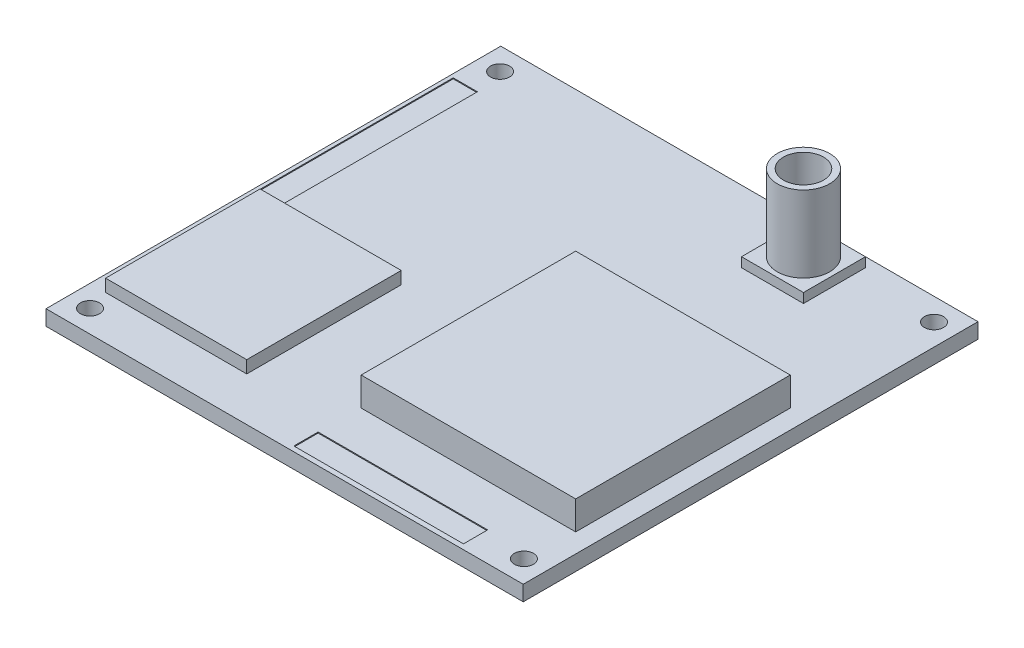
ISO-10303-21;
HEADER;
FILE_DESCRIPTION(('STEP AP214'),'2;1');
FILE_NAME('part.step','',(''),(''),'','','');
FILE_SCHEMA(('AUTOMOTIVE_DESIGN { 1 0 10303 214 1 1 1 1 }'));
ENDSEC;
DATA;
#1=APPLICATION_CONTEXT('core data for automotive mechanical design processes');
#2=APPLICATION_PROTOCOL_DEFINITION('international standard','automotive_design',2000,#1);
#3=PRODUCT_CONTEXT('',#1,'mechanical');
#4=PRODUCT('Part','Part','',(#3));
#5=PRODUCT_RELATED_PRODUCT_CATEGORY('part','',(#4));
#6=PRODUCT_DEFINITION_FORMATION('','',#4);
#7=PRODUCT_DEFINITION_CONTEXT('part definition',#1,'design');
#8=PRODUCT_DEFINITION('design','',#6,#7);
#9=PRODUCT_DEFINITION_SHAPE('','',#8);
#10=(LENGTH_UNIT() NAMED_UNIT(*) SI_UNIT(.MILLI.,.METRE.));
#11=(NAMED_UNIT(*) PLANE_ANGLE_UNIT() SI_UNIT($,.RADIAN.));
#12=(NAMED_UNIT(*) SI_UNIT($,.STERADIAN.) SOLID_ANGLE_UNIT());
#13=UNCERTAINTY_MEASURE_WITH_UNIT(LENGTH_MEASURE(1.E-05),#10,'distance_accuracy_value','');
#14=(GEOMETRIC_REPRESENTATION_CONTEXT(3) GLOBAL_UNCERTAINTY_ASSIGNED_CONTEXT((#13)) GLOBAL_UNIT_ASSIGNED_CONTEXT((#10,
#11,#12)) REPRESENTATION_CONTEXT('',''));
#15=CARTESIAN_POINT('',(0.,0.,0.));
#16=DIRECTION('',(0.,0.,1.));
#17=DIRECTION('',(1.,0.,0.));
#18=AXIS2_PLACEMENT_3D('',#15,#16,#17);
#19=CARTESIAN_POINT('',(0.,2.6,0.));
#20=DIRECTION('',(0.,1.,0.));
#21=DIRECTION('',(0.,0.,1.));
#22=AXIS2_PLACEMENT_3D('',#19,#20,#21);
#23=PLANE('',#22);
#24=DIRECTION('',(0.,0.,1.));
#25=VECTOR('',#24,1.);
#26=CARTESIAN_POINT('',(7.72150000000001,2.6,-22.8435));
#27=LINE('',#26,#25);
#28=CARTESIAN_POINT('',(7.72150000000001,2.6,-22.8435));
#29=VERTEX_POINT('',#28);
#30=CARTESIAN_POINT('',(7.72150000000001,2.6,-16.3435));
#31=VERTEX_POINT('',#30);
#32=EDGE_CURVE('E206',#29,#31,#27,.T.);
#33=ORIENTED_EDGE('',*,*,#32,.T.);
#34=DIRECTION('',(1.,0.,0.));
#35=VECTOR('',#34,1.);
#36=CARTESIAN_POINT('',(7.72150000000001,2.6,-16.3435));
#37=LINE('',#36,#35);
#38=CARTESIAN_POINT('',(14.2215,2.6,-16.3435));
#39=VERTEX_POINT('',#38);
#40=EDGE_CURVE('E195',#31,#39,#37,.T.);
#41=ORIENTED_EDGE('',*,*,#40,.T.);
#42=DIRECTION('',(0.,0.,-1.));
#43=VECTOR('',#42,1.);
#44=CARTESIAN_POINT('',(14.2215,2.6,-22.8435));
#45=LINE('',#44,#43);
#46=CARTESIAN_POINT('',(14.2215,2.6,-22.8435));
#47=VERTEX_POINT('',#46);
#48=EDGE_CURVE('E205',#39,#47,#45,.T.);
#49=ORIENTED_EDGE('',*,*,#48,.T.);
#50=DIRECTION('',(-1.,0.,0.));
#51=VECTOR('',#50,1.);
#52=CARTESIAN_POINT('',(7.72150000000001,2.6,-22.8435));
#53=LINE('',#52,#51);
#54=EDGE_CURVE('E210',#47,#29,#53,.T.);
#55=ORIENTED_EDGE('',*,*,#54,.T.);
#56=EDGE_LOOP('',(#33,#41,#49,#55));
#57=FACE_BOUND('',#56,.T.);
#58=CARTESIAN_POINT('',(10.9715,2.6,-19.5935));
#59=DIRECTION('',(0.,1.,0.));
#60=DIRECTION('',(0.,0.,1.));
#61=AXIS2_PLACEMENT_3D('',#58,#59,#60);
#62=CIRCLE('',#61,2.75);
#63=CARTESIAN_POINT('',(10.9715,2.6,-16.8435));
#64=VERTEX_POINT('',#63);
#65=EDGE_CURVE('E787',#64,#64,#62,.T.);
#66=ORIENTED_EDGE('',*,*,#65,.F.);
#67=EDGE_LOOP('',(#66));
#68=FACE_BOUND('',#67,.T.);
#69=ADVANCED_FACE('F34',(#57,#68),#23,.T.);
#70=CARTESIAN_POINT('',(0.,1.6,0.));
#71=DIRECTION('',(0.,1.,0.));
#72=DIRECTION('',(0.,0.,1.));
#73=AXIS2_PLACEMENT_3D('',#70,#71,#72);
#74=PLANE('',#73);
#75=DIRECTION('',(-1.,0.,0.));
#76=VECTOR('',#75,1.);
#77=CARTESIAN_POINT('',(-8.5715,1.6,3.0435));
#78=LINE('',#77,#76);
#79=CARTESIAN_POINT('',(-8.5715,1.6,3.0435));
#80=VERTEX_POINT('',#79);
#81=CARTESIAN_POINT('',(-23.3715,1.6,3.0435));
#82=VERTEX_POINT('',#81);
#83=EDGE_CURVE('E300',#80,#82,#78,.T.);
#84=ORIENTED_EDGE('',*,*,#83,.F.);
#85=DIRECTION('',(0.,0.,-1.));
#86=VECTOR('',#85,1.);
#87=CARTESIAN_POINT('',(-8.5715,1.6,19.2435));
#88=LINE('',#87,#86);
#89=CARTESIAN_POINT('',(-8.5715,1.6,19.2435));
#90=VERTEX_POINT('',#89);
#91=EDGE_CURVE('E280',#90,#80,#88,.T.);
#92=ORIENTED_EDGE('',*,*,#91,.F.);
#93=DIRECTION('',(1.,0.,0.));
#94=VECTOR('',#93,1.);
#95=CARTESIAN_POINT('',(-8.5715,1.6,19.2435));
#96=LINE('',#95,#94);
#97=CARTESIAN_POINT('',(-23.3715,1.6,19.2435));
#98=VERTEX_POINT('',#97);
#99=EDGE_CURVE('E291',#98,#90,#96,.T.);
#100=ORIENTED_EDGE('',*,*,#99,.F.);
#101=DIRECTION('',(0.,0.,1.));
#102=VECTOR('',#101,1.);
#103=CARTESIAN_POINT('',(-23.3715,1.6,19.2435));
#104=LINE('',#103,#102);
#105=EDGE_CURVE('E302',#82,#98,#104,.T.);
#106=ORIENTED_EDGE('',*,*,#105,.F.);
#107=EDGE_LOOP('',(#84,#92,#100,#106));
#108=FACE_BOUND('',#107,.T.);
#109=DIRECTION('',(0.,0.,1.));
#110=VECTOR('',#109,1.);
#111=CARTESIAN_POINT('',(-25.0215,1.6,-23.8435));
#112=LINE('',#111,#110);
#113=CARTESIAN_POINT('',(-25.0215,1.6,-23.8435));
#114=VERTEX_POINT('',#113);
#115=CARTESIAN_POINT('',(-25.0215,1.6,23.8435));
#116=VERTEX_POINT('',#115);
#117=EDGE_CURVE('E369',#114,#116,#112,.T.);
#118=ORIENTED_EDGE('',*,*,#117,.T.);
#119=DIRECTION('',(1.,0.,0.));
#120=VECTOR('',#119,1.);
#121=CARTESIAN_POINT('',(-25.0215,1.6,23.8435));
#122=LINE('',#121,#120);
#123=CARTESIAN_POINT('',(25.0215,1.6,23.8435));
#124=VERTEX_POINT('',#123);
#125=EDGE_CURVE('E372',#116,#124,#122,.T.);
#126=ORIENTED_EDGE('',*,*,#125,.T.);
#127=DIRECTION('',(0.,0.,-1.));
#128=VECTOR('',#127,1.);
#129=CARTESIAN_POINT('',(25.0215,1.6,-23.8435));
#130=LINE('',#129,#128);
#131=CARTESIAN_POINT('',(25.0215,1.6,-23.8435));
#132=VERTEX_POINT('',#131);
#133=EDGE_CURVE('E375',#124,#132,#130,.T.);
#134=ORIENTED_EDGE('',*,*,#133,.T.);
#135=DIRECTION('',(-1.,0.,0.));
#136=VECTOR('',#135,1.);
#137=CARTESIAN_POINT('',(-25.0215,1.6,-23.8435));
#138=LINE('',#137,#136);
#139=EDGE_CURVE('E377',#132,#114,#138,.T.);
#140=ORIENTED_EDGE('',*,*,#139,.T.);
#141=EDGE_LOOP('',(#118,#126,#134,#140));
#142=FACE_BOUND('',#141,.T.);
#143=CARTESIAN_POINT('',(-22.75,1.6,-21.5));
#144=DIRECTION('',(0.,1.,0.));
#145=DIRECTION('',(0.,0.,1.));
#146=AXIS2_PLACEMENT_3D('',#143,#144,#145);
#147=CIRCLE('',#146,1.);
#148=CARTESIAN_POINT('',(-22.75,1.6,-20.5));
#149=VERTEX_POINT('',#148);
#150=EDGE_CURVE('E360',#149,#149,#147,.T.);
#151=ORIENTED_EDGE('',*,*,#150,.F.);
#152=EDGE_LOOP('',(#151));
#153=FACE_BOUND('',#152,.T.);
#154=CARTESIAN_POINT('',(22.75,1.6,-21.5));
#155=DIRECTION('',(0.,1.,0.));
#156=DIRECTION('',(0.,0.,-1.));
#157=AXIS2_PLACEMENT_3D('',#154,#155,#156);
#158=CIRCLE('',#157,1.);
#159=CARTESIAN_POINT('',(22.75,1.6,-22.5));
#160=VERTEX_POINT('',#159);
#161=EDGE_CURVE('E354',#160,#160,#158,.T.);
#162=ORIENTED_EDGE('',*,*,#161,.F.);
#163=EDGE_LOOP('',(#162));
#164=FACE_BOUND('',#163,.T.);
#165=CARTESIAN_POINT('',(22.75,1.6,21.5));
#166=DIRECTION('',(0.,1.,0.));
#167=DIRECTION('',(0.,0.,1.));
#168=AXIS2_PLACEMENT_3D('',#165,#166,#167);
#169=CIRCLE('',#168,1.);
#170=CARTESIAN_POINT('',(22.75,1.6,22.5));
#171=VERTEX_POINT('',#170);
#172=EDGE_CURVE('E348',#171,#171,#169,.T.);
#173=ORIENTED_EDGE('',*,*,#172,.F.);
#174=EDGE_LOOP('',(#173));
#175=FACE_BOUND('',#174,.T.);
#176=CARTESIAN_POINT('',(-22.75,1.6,21.5));
#177=DIRECTION('',(0.,1.,0.));
#178=DIRECTION('',(0.,0.,-1.));
#179=AXIS2_PLACEMENT_3D('',#176,#177,#178);
#180=CIRCLE('',#179,1.);
#181=CARTESIAN_POINT('',(-22.75,1.6,20.5));
#182=VERTEX_POINT('',#181);
#183=EDGE_CURVE('E344',#182,#182,#180,.T.);
#184=ORIENTED_EDGE('',*,*,#183,.F.);
#185=EDGE_LOOP('',(#184));
#186=FACE_BOUND('',#185,.T.);
#187=DIRECTION('',(-1.,0.,0.));
#188=VECTOR('',#187,1.);
#189=CARTESIAN_POINT('',(23.0215,1.6,-6.1565));
#190=LINE('',#189,#188);
#191=CARTESIAN_POINT('',(23.0215,1.6,-6.1565));
#192=VERTEX_POINT('',#191);
#193=CARTESIAN_POINT('',(0.521500000000015,1.6,-6.1565));
#194=VERTEX_POINT('',#193);
#195=EDGE_CURVE('E329',#192,#194,#190,.T.);
#196=ORIENTED_EDGE('',*,*,#195,.F.);
#197=DIRECTION('',(0.,0.,-1.));
#198=VECTOR('',#197,1.);
#199=CARTESIAN_POINT('',(23.0215,1.6,16.3435));
#200=LINE('',#199,#198);
#201=CARTESIAN_POINT('',(23.0215,1.6,16.3435));
#202=VERTEX_POINT('',#201);
#203=EDGE_CURVE('E315',#202,#192,#200,.T.);
#204=ORIENTED_EDGE('',*,*,#203,.F.);
#205=DIRECTION('',(1.,0.,0.));
#206=VECTOR('',#205,1.);
#207=CARTESIAN_POINT('',(23.0215,1.6,16.3435));
#208=LINE('',#207,#206);
#209=CARTESIAN_POINT('',(0.521500000000015,1.6,16.3435));
#210=VERTEX_POINT('',#209);
#211=EDGE_CURVE('E320',#210,#202,#208,.T.);
#212=ORIENTED_EDGE('',*,*,#211,.F.);
#213=DIRECTION('',(0.,0.,1.));
#214=VECTOR('',#213,1.);
#215=CARTESIAN_POINT('',(0.521500000000015,1.6,16.3435));
#216=LINE('',#215,#214);
#217=EDGE_CURVE('E331',#194,#210,#216,.T.);
#218=ORIENTED_EDGE('',*,*,#217,.F.);
#219=EDGE_LOOP('',(#196,#204,#212,#218));
#220=FACE_BOUND('',#219,.T.);
#221=DIRECTION('',(0.,0.,1.));
#222=VECTOR('',#221,1.);
#223=CARTESIAN_POINT('',(-24.6415,1.6,-18.4765));
#224=LINE('',#223,#222);
#225=CARTESIAN_POINT('',(-24.6415,1.6,-18.4765));
#226=VERTEX_POINT('',#225);
#227=CARTESIAN_POINT('',(-24.6415,1.6,1.8435));
#228=VERTEX_POINT('',#227);
#229=EDGE_CURVE('E249',#226,#228,#224,.T.);
#230=ORIENTED_EDGE('',*,*,#229,.F.);
#231=DIRECTION('',(-1.,0.,0.));
#232=VECTOR('',#231,1.);
#233=CARTESIAN_POINT('',(-24.6415,1.6,-18.4765));
#234=LINE('',#233,#232);
#235=CARTESIAN_POINT('',(-22.1015,1.6,-18.4765));
#236=VERTEX_POINT('',#235);
#237=EDGE_CURVE('E259',#236,#226,#234,.T.);
#238=ORIENTED_EDGE('',*,*,#237,.F.);
#239=DIRECTION('',(0.,0.,-1.));
#240=VECTOR('',#239,1.);
#241=CARTESIAN_POINT('',(-22.1015,1.6,-18.4765));
#242=LINE('',#241,#240);
#243=CARTESIAN_POINT('',(-22.1015,1.6,1.8435));
#244=VERTEX_POINT('',#243);
#245=EDGE_CURVE('E273',#244,#236,#242,.T.);
#246=ORIENTED_EDGE('',*,*,#245,.F.);
#247=DIRECTION('',(1.,0.,0.));
#248=VECTOR('',#247,1.);
#249=CARTESIAN_POINT('',(-24.6415,1.6,1.8435));
#250=LINE('',#249,#248);
#251=EDGE_CURVE('E270',#228,#244,#250,.T.);
#252=ORIENTED_EDGE('',*,*,#251,.F.);
#253=EDGE_LOOP('',(#230,#238,#246,#252));
#254=FACE_BOUND('',#253,.T.);
#255=DIRECTION('',(0.,0.,1.));
#256=VECTOR('',#255,1.);
#257=CARTESIAN_POINT('',(0.441500000000011,1.6,20.7735));
#258=LINE('',#257,#256);
#259=CARTESIAN_POINT('',(0.441500000000011,1.6,20.7735));
#260=VERTEX_POINT('',#259);
#261=CARTESIAN_POINT('',(0.441500000000011,1.6,23.3135));
#262=VERTEX_POINT('',#261);
#263=EDGE_CURVE('E57',#260,#262,#258,.T.);
#264=ORIENTED_EDGE('',*,*,#263,.F.);
#265=DIRECTION('',(-1.,0.,0.));
#266=VECTOR('',#265,1.);
#267=CARTESIAN_POINT('',(0.441500000000011,1.6,20.7735));
#268=LINE('',#267,#266);
#269=CARTESIAN_POINT('',(18.2215,1.6,20.7735));
#270=VERTEX_POINT('',#269);
#271=EDGE_CURVE('E230',#270,#260,#268,.T.);
#272=ORIENTED_EDGE('',*,*,#271,.F.);
#273=DIRECTION('',(0.,0.,-1.));
#274=VECTOR('',#273,1.);
#275=CARTESIAN_POINT('',(18.2215,1.6,20.7735));
#276=LINE('',#275,#274);
#277=CARTESIAN_POINT('',(18.2215,1.6,23.3135));
#278=VERTEX_POINT('',#277);
#279=EDGE_CURVE('E242',#278,#270,#276,.T.);
#280=ORIENTED_EDGE('',*,*,#279,.F.);
#281=DIRECTION('',(1.,0.,0.));
#282=VECTOR('',#281,1.);
#283=CARTESIAN_POINT('',(0.441500000000011,1.6,23.3135));
#284=LINE('',#283,#282);
#285=EDGE_CURVE('E221',#262,#278,#284,.T.);
#286=ORIENTED_EDGE('',*,*,#285,.F.);
#287=EDGE_LOOP('',(#264,#272,#280,#286));
#288=FACE_BOUND('',#287,.T.);
#289=DIRECTION('',(1.,0.,0.));
#290=VECTOR('',#289,1.);
#291=CARTESIAN_POINT('',(7.72150000000001,1.6,-16.3435));
#292=LINE('',#291,#290);
#293=CARTESIAN_POINT('',(7.72150000000001,1.6,-16.3435));
#294=VERTEX_POINT('',#293);
#295=CARTESIAN_POINT('',(14.2215,1.6,-16.3435));
#296=VERTEX_POINT('',#295);
#297=EDGE_CURVE('E802',#294,#296,#292,.T.);
#298=ORIENTED_EDGE('',*,*,#297,.F.);
#299=DIRECTION('',(0.,0.,1.));
#300=VECTOR('',#299,1.);
#301=CARTESIAN_POINT('',(7.72150000000001,1.6,-22.8435));
#302=LINE('',#301,#300);
#303=CARTESIAN_POINT('',(7.72150000000001,1.6,-22.8435));
#304=VERTEX_POINT('',#303);
#305=EDGE_CURVE('E218',#304,#294,#302,.T.);
#306=ORIENTED_EDGE('',*,*,#305,.F.);
#307=DIRECTION('',(-1.,0.,0.));
#308=VECTOR('',#307,1.);
#309=CARTESIAN_POINT('',(7.72150000000001,1.6,-22.8435));
#310=LINE('',#309,#308);
#311=CARTESIAN_POINT('',(14.2215,1.6,-22.8435));
#312=VERTEX_POINT('',#311);
#313=EDGE_CURVE('E214',#312,#304,#310,.T.);
#314=ORIENTED_EDGE('',*,*,#313,.F.);
#315=DIRECTION('',(0.,0.,-1.));
#316=VECTOR('',#315,1.);
#317=CARTESIAN_POINT('',(14.2215,1.6,-22.8435));
#318=LINE('',#317,#316);
#319=EDGE_CURVE('E804',#296,#312,#318,.T.);
#320=ORIENTED_EDGE('',*,*,#319,.F.);
#321=EDGE_LOOP('',(#298,#306,#314,#320));
#322=FACE_BOUND('',#321,.T.);
#323=ADVANCED_FACE('F411',(#108,#142,#153,#164,#175,#186,#220,#254,#288,#322),#74,.T.);
#324=CARTESIAN_POINT('',(-25.0215,1.6,-23.8435));
#325=DIRECTION('',(1.,0.,0.));
#326=DIRECTION('',(0.,0.,-1.));
#327=AXIS2_PLACEMENT_3D('',#324,#325,#326);
#328=PLANE('',#327);
#329=DIRECTION('',(0.,0.,1.));
#330=VECTOR('',#329,1.);
#331=CARTESIAN_POINT('',(-25.0215,0.,-23.8435));
#332=LINE('',#331,#330);
#333=CARTESIAN_POINT('',(-25.0215,0.,-23.8435));
#334=VERTEX_POINT('',#333);
#335=CARTESIAN_POINT('',(-25.0215,0.,23.8435));
#336=VERTEX_POINT('',#335);
#337=EDGE_CURVE('E366',#334,#336,#332,.T.);
#338=ORIENTED_EDGE('',*,*,#337,.T.);
#339=DIRECTION('',(0.,-1.,0.));
#340=VECTOR('',#339,1.);
#341=CARTESIAN_POINT('',(-25.0215,1.6,23.8435));
#342=LINE('',#341,#340);
#343=EDGE_CURVE('E11',#116,#336,#342,.T.);
#344=ORIENTED_EDGE('',*,*,#343,.F.);
#345=ORIENTED_EDGE('',*,*,#117,.F.);
#346=DIRECTION('',(0.,-1.,0.));
#347=VECTOR('',#346,1.);
#348=CARTESIAN_POINT('',(-25.0215,1.6,-23.8435));
#349=LINE('',#348,#347);
#350=EDGE_CURVE('E379',#114,#334,#349,.T.);
#351=ORIENTED_EDGE('',*,*,#350,.T.);
#352=EDGE_LOOP('',(#338,#344,#345,#351));
#353=FACE_BOUND('',#352,.T.);
#354=ADVANCED_FACE('F36',(#353),#328,.F.);
#355=CARTESIAN_POINT('',(-25.0215,1.6,23.8435));
#356=DIRECTION('',(0.,0.,-1.));
#357=DIRECTION('',(-1.,0.,0.));
#358=AXIS2_PLACEMENT_3D('',#355,#356,#357);
#359=PLANE('',#358);
#360=DIRECTION('',(1.,0.,0.));
#361=VECTOR('',#360,1.);
#362=CARTESIAN_POINT('',(-25.0215,0.,23.8435));
#363=LINE('',#362,#361);
#364=CARTESIAN_POINT('',(25.0215,0.,23.8435));
#365=VERTEX_POINT('',#364);
#366=EDGE_CURVE('E382',#336,#365,#363,.T.);
#367=ORIENTED_EDGE('',*,*,#366,.T.);
#368=DIRECTION('',(0.,-1.,0.));
#369=VECTOR('',#368,1.);
#370=CARTESIAN_POINT('',(25.0215,1.6,23.8435));
#371=LINE('',#370,#369);
#372=EDGE_CURVE('E42',#124,#365,#371,.T.);
#373=ORIENTED_EDGE('',*,*,#372,.F.);
#374=ORIENTED_EDGE('',*,*,#125,.F.);
#375=ORIENTED_EDGE('',*,*,#343,.T.);
#376=EDGE_LOOP('',(#367,#373,#374,#375));
#377=FACE_BOUND('',#376,.T.);
#378=ADVANCED_FACE('F413',(#377),#359,.F.);
#379=CARTESIAN_POINT('',(25.0215,1.6,-23.8435));
#380=DIRECTION('',(-1.,0.,0.));
#381=DIRECTION('',(0.,0.,1.));
#382=AXIS2_PLACEMENT_3D('',#379,#380,#381);
#383=PLANE('',#382);
#384=DIRECTION('',(0.,0.,-1.));
#385=VECTOR('',#384,1.);
#386=CARTESIAN_POINT('',(25.0215,0.,-23.8435));
#387=LINE('',#386,#385);
#388=CARTESIAN_POINT('',(25.0215,0.,-23.8435));
#389=VERTEX_POINT('',#388);
#390=EDGE_CURVE('E384',#365,#389,#387,.T.);
#391=ORIENTED_EDGE('',*,*,#390,.T.);
#392=DIRECTION('',(0.,-1.,0.));
#393=VECTOR('',#392,1.);
#394=CARTESIAN_POINT('',(25.0215,1.6,-23.8435));
#395=LINE('',#394,#393);
#396=EDGE_CURVE('E389',#132,#389,#395,.T.);
#397=ORIENTED_EDGE('',*,*,#396,.F.);
#398=ORIENTED_EDGE('',*,*,#133,.F.);
#399=ORIENTED_EDGE('',*,*,#372,.T.);
#400=EDGE_LOOP('',(#391,#397,#398,#399));
#401=FACE_BOUND('',#400,.T.);
#402=ADVANCED_FACE('F396',(#401),#383,.F.);
#403=CARTESIAN_POINT('',(-25.0215,1.6,-23.8435));
#404=DIRECTION('',(0.,0.,1.));
#405=DIRECTION('',(1.,0.,0.));
#406=AXIS2_PLACEMENT_3D('',#403,#404,#405);
#407=PLANE('',#406);
#408=DIRECTION('',(-1.,0.,0.));
#409=VECTOR('',#408,1.);
#410=CARTESIAN_POINT('',(-25.0215,0.,-23.8435));
#411=LINE('',#410,#409);
#412=EDGE_CURVE('E373',#389,#334,#411,.T.);
#413=ORIENTED_EDGE('',*,*,#412,.T.);
#414=ORIENTED_EDGE('',*,*,#350,.F.);
#415=ORIENTED_EDGE('',*,*,#139,.F.);
#416=ORIENTED_EDGE('',*,*,#396,.T.);
#417=EDGE_LOOP('',(#413,#414,#415,#416));
#418=FACE_BOUND('',#417,.T.);
#419=ADVANCED_FACE('F405',(#418),#407,.F.);
#420=CARTESIAN_POINT('',(0.,0.,0.));
#421=DIRECTION('',(0.,1.,0.));
#422=DIRECTION('',(0.,0.,1.));
#423=AXIS2_PLACEMENT_3D('',#420,#421,#422);
#424=PLANE('',#423);
#425=CARTESIAN_POINT('',(-22.75,0.,21.5));
#426=DIRECTION('',(0.,1.,0.));
#427=DIRECTION('',(0.,0.,-1.));
#428=AXIS2_PLACEMENT_3D('',#425,#426,#427);
#429=CIRCLE('',#428,1.);
#430=CARTESIAN_POINT('',(-22.75,0.,20.5));
#431=VERTEX_POINT('',#430);
#432=EDGE_CURVE('E345',#431,#431,#429,.T.);
#433=ORIENTED_EDGE('',*,*,#432,.T.);
#434=EDGE_LOOP('',(#433));
#435=FACE_BOUND('',#434,.T.);
#436=CARTESIAN_POINT('',(22.75,0.,21.5));
#437=DIRECTION('',(0.,1.,0.));
#438=DIRECTION('',(0.,0.,1.));
#439=AXIS2_PLACEMENT_3D('',#436,#437,#438);
#440=CIRCLE('',#439,1.);
#441=CARTESIAN_POINT('',(22.75,0.,22.5));
#442=VERTEX_POINT('',#441);
#443=EDGE_CURVE('E351',#442,#442,#440,.T.);
#444=ORIENTED_EDGE('',*,*,#443,.T.);
#445=EDGE_LOOP('',(#444));
#446=FACE_BOUND('',#445,.T.);
#447=CARTESIAN_POINT('',(22.75,0.,-21.5));
#448=DIRECTION('',(0.,1.,0.));
#449=DIRECTION('',(0.,0.,-1.));
#450=AXIS2_PLACEMENT_3D('',#447,#448,#449);
#451=CIRCLE('',#450,1.);
#452=CARTESIAN_POINT('',(22.75,0.,-22.5));
#453=VERTEX_POINT('',#452);
#454=EDGE_CURVE('E357',#453,#453,#451,.T.);
#455=ORIENTED_EDGE('',*,*,#454,.T.);
#456=EDGE_LOOP('',(#455));
#457=FACE_BOUND('',#456,.T.);
#458=CARTESIAN_POINT('',(-22.75,0.,-21.5));
#459=DIRECTION('',(0.,1.,0.));
#460=DIRECTION('',(0.,0.,1.));
#461=AXIS2_PLACEMENT_3D('',#458,#459,#460);
#462=CIRCLE('',#461,1.);
#463=CARTESIAN_POINT('',(-22.75,0.,-20.5));
#464=VERTEX_POINT('',#463);
#465=EDGE_CURVE('E363',#464,#464,#462,.T.);
#466=ORIENTED_EDGE('',*,*,#465,.T.);
#467=EDGE_LOOP('',(#466));
#468=FACE_BOUND('',#467,.T.);
#469=ORIENTED_EDGE('',*,*,#337,.F.);
#470=ORIENTED_EDGE('',*,*,#412,.F.);
#471=ORIENTED_EDGE('',*,*,#390,.F.);
#472=ORIENTED_EDGE('',*,*,#366,.F.);
#473=EDGE_LOOP('',(#469,#470,#471,#472));
#474=FACE_BOUND('',#473,.T.);
#475=ADVANCED_FACE('F402',(#435,#446,#457,#468,#474),#424,.F.);
#476=CARTESIAN_POINT('',(-22.75,0.,-21.5));
#477=DIRECTION('',(0.,1.,0.));
#478=DIRECTION('',(0.,0.,1.));
#479=AXIS2_PLACEMENT_3D('',#476,#477,#478);
#480=CYLINDRICAL_SURFACE('',#479,1.);
#481=ORIENTED_EDGE('',*,*,#465,.F.);
#482=EDGE_LOOP('',(#481));
#483=FACE_BOUND('',#482,.T.);
#484=ORIENTED_EDGE('',*,*,#150,.T.);
#485=EDGE_LOOP('',(#484));
#486=FACE_BOUND('',#485,.T.);
#487=ADVANCED_FACE('F532',(#483,#486),#480,.F.);
#488=CARTESIAN_POINT('',(22.75,0.,-21.5));
#489=DIRECTION('',(0.,1.,0.));
#490=DIRECTION('',(0.,0.,1.));
#491=AXIS2_PLACEMENT_3D('',#488,#489,#490);
#492=CYLINDRICAL_SURFACE('',#491,1.);
#493=ORIENTED_EDGE('',*,*,#454,.F.);
#494=EDGE_LOOP('',(#493));
#495=FACE_BOUND('',#494,.T.);
#496=ORIENTED_EDGE('',*,*,#161,.T.);
#497=EDGE_LOOP('',(#496));
#498=FACE_BOUND('',#497,.T.);
#499=ADVANCED_FACE('F528',(#495,#498),#492,.F.);
#500=CARTESIAN_POINT('',(22.75,0.,21.5));
#501=DIRECTION('',(0.,1.,0.));
#502=DIRECTION('',(0.,0.,1.));
#503=AXIS2_PLACEMENT_3D('',#500,#501,#502);
#504=CYLINDRICAL_SURFACE('',#503,1.);
#505=ORIENTED_EDGE('',*,*,#443,.F.);
#506=EDGE_LOOP('',(#505));
#507=FACE_BOUND('',#506,.T.);
#508=ORIENTED_EDGE('',*,*,#172,.T.);
#509=EDGE_LOOP('',(#508));
#510=FACE_BOUND('',#509,.T.);
#511=ADVANCED_FACE('F524',(#507,#510),#504,.F.);
#512=CARTESIAN_POINT('',(-22.75,0.,21.5));
#513=DIRECTION('',(0.,1.,0.));
#514=DIRECTION('',(0.,0.,1.));
#515=AXIS2_PLACEMENT_3D('',#512,#513,#514);
#516=CYLINDRICAL_SURFACE('',#515,1.);
#517=ORIENTED_EDGE('',*,*,#432,.F.);
#518=EDGE_LOOP('',(#517));
#519=FACE_BOUND('',#518,.T.);
#520=ORIENTED_EDGE('',*,*,#183,.T.);
#521=EDGE_LOOP('',(#520));
#522=FACE_BOUND('',#521,.T.);
#523=ADVANCED_FACE('F520',(#519,#522),#516,.F.);
#524=CARTESIAN_POINT('',(23.0215,4.6,16.3435));
#525=DIRECTION('',(-1.,0.,0.));
#526=DIRECTION('',(0.,0.,1.));
#527=AXIS2_PLACEMENT_3D('',#524,#525,#526);
#528=PLANE('',#527);
#529=ORIENTED_EDGE('',*,*,#203,.T.);
#530=DIRECTION('',(0.,-1.,0.));
#531=VECTOR('',#530,1.);
#532=CARTESIAN_POINT('',(23.0215,4.6,-6.1565));
#533=LINE('',#532,#531);
#534=CARTESIAN_POINT('',(23.0215,4.6,-6.1565));
#535=VERTEX_POINT('',#534);
#536=EDGE_CURVE('E342',#535,#192,#533,.T.);
#537=ORIENTED_EDGE('',*,*,#536,.F.);
#538=DIRECTION('',(0.,0.,-1.));
#539=VECTOR('',#538,1.);
#540=CARTESIAN_POINT('',(23.0215,4.6,16.3435));
#541=LINE('',#540,#539);
#542=CARTESIAN_POINT('',(23.0215,4.6,16.3435));
#543=VERTEX_POINT('',#542);
#544=EDGE_CURVE('E316',#543,#535,#541,.T.);
#545=ORIENTED_EDGE('',*,*,#544,.F.);
#546=DIRECTION('',(0.,-1.,0.));
#547=VECTOR('',#546,1.);
#548=CARTESIAN_POINT('',(23.0215,4.6,16.3435));
#549=LINE('',#548,#547);
#550=EDGE_CURVE('E326',#543,#202,#549,.T.);
#551=ORIENTED_EDGE('',*,*,#550,.T.);
#552=EDGE_LOOP('',(#529,#537,#545,#551));
#553=FACE_BOUND('',#552,.T.);
#554=ADVANCED_FACE('F516',(#553),#528,.F.);
#555=CARTESIAN_POINT('',(23.0215,4.6,-6.1565));
#556=DIRECTION('',(0.,0.,1.));
#557=DIRECTION('',(1.,0.,0.));
#558=AXIS2_PLACEMENT_3D('',#555,#556,#557);
#559=PLANE('',#558);
#560=ORIENTED_EDGE('',*,*,#195,.T.);
#561=DIRECTION('',(0.,-1.,0.));
#562=VECTOR('',#561,1.);
#563=CARTESIAN_POINT('',(0.521500000000015,4.6,-6.1565));
#564=LINE('',#563,#562);
#565=CARTESIAN_POINT('',(0.521500000000015,4.6,-6.1565));
#566=VERTEX_POINT('',#565);
#567=EDGE_CURVE('E339',#566,#194,#564,.T.);
#568=ORIENTED_EDGE('',*,*,#567,.F.);
#569=DIRECTION('',(-1.,0.,0.));
#570=VECTOR('',#569,1.);
#571=CARTESIAN_POINT('',(23.0215,4.6,-6.1565));
#572=LINE('',#571,#570);
#573=EDGE_CURVE('E319',#535,#566,#572,.T.);
#574=ORIENTED_EDGE('',*,*,#573,.F.);
#575=ORIENTED_EDGE('',*,*,#536,.T.);
#576=EDGE_LOOP('',(#560,#568,#574,#575));
#577=FACE_BOUND('',#576,.T.);
#578=ADVANCED_FACE('F512',(#577),#559,.F.);
#579=CARTESIAN_POINT('',(0.521500000000015,4.6,16.3435));
#580=DIRECTION('',(1.,0.,0.));
#581=DIRECTION('',(0.,0.,-1.));
#582=AXIS2_PLACEMENT_3D('',#579,#580,#581);
#583=PLANE('',#582);
#584=ORIENTED_EDGE('',*,*,#217,.T.);
#585=DIRECTION('',(0.,-1.,0.));
#586=VECTOR('',#585,1.);
#587=CARTESIAN_POINT('',(0.521500000000015,4.6,16.3435));
#588=LINE('',#587,#586);
#589=CARTESIAN_POINT('',(0.521500000000015,4.6,16.3435));
#590=VERTEX_POINT('',#589);
#591=EDGE_CURVE('E337',#590,#210,#588,.T.);
#592=ORIENTED_EDGE('',*,*,#591,.F.);
#593=DIRECTION('',(0.,0.,1.));
#594=VECTOR('',#593,1.);
#595=CARTESIAN_POINT('',(0.521500000000015,4.6,16.3435));
#596=LINE('',#595,#594);
#597=EDGE_CURVE('E322',#566,#590,#596,.T.);
#598=ORIENTED_EDGE('',*,*,#597,.F.);
#599=ORIENTED_EDGE('',*,*,#567,.T.);
#600=EDGE_LOOP('',(#584,#592,#598,#599));
#601=FACE_BOUND('',#600,.T.);
#602=ADVANCED_FACE('F508',(#601),#583,.F.);
#603=CARTESIAN_POINT('',(23.0215,4.6,16.3435));
#604=DIRECTION('',(0.,0.,-1.));
#605=DIRECTION('',(-1.,0.,0.));
#606=AXIS2_PLACEMENT_3D('',#603,#604,#605);
#607=PLANE('',#606);
#608=ORIENTED_EDGE('',*,*,#211,.T.);
#609=ORIENTED_EDGE('',*,*,#550,.F.);
#610=DIRECTION('',(1.,0.,0.));
#611=VECTOR('',#610,1.);
#612=CARTESIAN_POINT('',(23.0215,4.6,16.3435));
#613=LINE('',#612,#611);
#614=EDGE_CURVE('E324',#590,#543,#613,.T.);
#615=ORIENTED_EDGE('',*,*,#614,.F.);
#616=ORIENTED_EDGE('',*,*,#591,.T.);
#617=EDGE_LOOP('',(#608,#609,#615,#616));
#618=FACE_BOUND('',#617,.T.);
#619=ADVANCED_FACE('F504',(#618),#607,.F.);
#620=CARTESIAN_POINT('',(0.,4.6,0.));
#621=DIRECTION('',(0.,1.,0.));
#622=DIRECTION('',(0.,0.,1.));
#623=AXIS2_PLACEMENT_3D('',#620,#621,#622);
#624=PLANE('',#623);
#625=ORIENTED_EDGE('',*,*,#544,.T.);
#626=ORIENTED_EDGE('',*,*,#573,.T.);
#627=ORIENTED_EDGE('',*,*,#597,.T.);
#628=ORIENTED_EDGE('',*,*,#614,.T.);
#629=EDGE_LOOP('',(#625,#626,#627,#628));
#630=FACE_BOUND('',#629,.T.);
#631=ADVANCED_FACE('F500',(#630),#624,.T.);
#632=CARTESIAN_POINT('',(-8.5715,2.9,19.2435));
#633=DIRECTION('',(-1.,0.,0.));
#634=DIRECTION('',(0.,0.,1.));
#635=AXIS2_PLACEMENT_3D('',#632,#633,#634);
#636=PLANE('',#635);
#637=ORIENTED_EDGE('',*,*,#91,.T.);
#638=DIRECTION('',(0.,-1.,0.));
#639=VECTOR('',#638,1.);
#640=CARTESIAN_POINT('',(-8.5715,2.9,3.0435));
#641=LINE('',#640,#639);
#642=CARTESIAN_POINT('',(-8.5715,2.9,3.0435));
#643=VERTEX_POINT('',#642);
#644=EDGE_CURVE('E313',#643,#80,#641,.T.);
#645=ORIENTED_EDGE('',*,*,#644,.F.);
#646=DIRECTION('',(0.,0.,-1.));
#647=VECTOR('',#646,1.);
#648=CARTESIAN_POINT('',(-8.5715,2.9,19.2435));
#649=LINE('',#648,#647);
#650=CARTESIAN_POINT('',(-8.5715,2.9,19.2435));
#651=VERTEX_POINT('',#650);
#652=EDGE_CURVE('E287',#651,#643,#649,.T.);
#653=ORIENTED_EDGE('',*,*,#652,.F.);
#654=DIRECTION('',(0.,-1.,0.));
#655=VECTOR('',#654,1.);
#656=CARTESIAN_POINT('',(-8.5715,2.9,19.2435));
#657=LINE('',#656,#655);
#658=EDGE_CURVE('E297',#651,#90,#657,.T.);
#659=ORIENTED_EDGE('',*,*,#658,.T.);
#660=EDGE_LOOP('',(#637,#645,#653,#659));
#661=FACE_BOUND('',#660,.T.);
#662=ADVANCED_FACE('F496',(#661),#636,.F.);
#663=CARTESIAN_POINT('',(-8.5715,2.9,3.0435));
#664=DIRECTION('',(0.,0.,1.));
#665=DIRECTION('',(1.,0.,0.));
#666=AXIS2_PLACEMENT_3D('',#663,#664,#665);
#667=PLANE('',#666);
#668=ORIENTED_EDGE('',*,*,#83,.T.);
#669=DIRECTION('',(0.,-1.,0.));
#670=VECTOR('',#669,1.);
#671=CARTESIAN_POINT('',(-23.3715,2.9,3.0435));
#672=LINE('',#671,#670);
#673=CARTESIAN_POINT('',(-23.3715,2.9,3.0435));
#674=VERTEX_POINT('',#673);
#675=EDGE_CURVE('E310',#674,#82,#672,.T.);
#676=ORIENTED_EDGE('',*,*,#675,.F.);
#677=DIRECTION('',(-1.,0.,0.));
#678=VECTOR('',#677,1.);
#679=CARTESIAN_POINT('',(-8.5715,2.9,3.0435));
#680=LINE('',#679,#678);
#681=EDGE_CURVE('E290',#643,#674,#680,.T.);
#682=ORIENTED_EDGE('',*,*,#681,.F.);
#683=ORIENTED_EDGE('',*,*,#644,.T.);
#684=EDGE_LOOP('',(#668,#676,#682,#683));
#685=FACE_BOUND('',#684,.T.);
#686=ADVANCED_FACE('F492',(#685),#667,.F.);
#687=CARTESIAN_POINT('',(-23.3715,2.9,19.2435));
#688=DIRECTION('',(1.,0.,0.));
#689=DIRECTION('',(0.,0.,-1.));
#690=AXIS2_PLACEMENT_3D('',#687,#688,#689);
#691=PLANE('',#690);
#692=ORIENTED_EDGE('',*,*,#105,.T.);
#693=DIRECTION('',(0.,-1.,0.));
#694=VECTOR('',#693,1.);
#695=CARTESIAN_POINT('',(-23.3715,2.9,19.2435));
#696=LINE('',#695,#694);
#697=CARTESIAN_POINT('',(-23.3715,2.9,19.2435));
#698=VERTEX_POINT('',#697);
#699=EDGE_CURVE('E308',#698,#98,#696,.T.);
#700=ORIENTED_EDGE('',*,*,#699,.F.);
#701=DIRECTION('',(0.,0.,1.));
#702=VECTOR('',#701,1.);
#703=CARTESIAN_POINT('',(-23.3715,2.9,19.2435));
#704=LINE('',#703,#702);
#705=EDGE_CURVE('E293',#674,#698,#704,.T.);
#706=ORIENTED_EDGE('',*,*,#705,.F.);
#707=ORIENTED_EDGE('',*,*,#675,.T.);
#708=EDGE_LOOP('',(#692,#700,#706,#707));
#709=FACE_BOUND('',#708,.T.);
#710=ADVANCED_FACE('F488',(#709),#691,.F.);
#711=CARTESIAN_POINT('',(-8.5715,2.9,19.2435));
#712=DIRECTION('',(0.,0.,-1.));
#713=DIRECTION('',(-1.,0.,0.));
#714=AXIS2_PLACEMENT_3D('',#711,#712,#713);
#715=PLANE('',#714);
#716=ORIENTED_EDGE('',*,*,#99,.T.);
#717=ORIENTED_EDGE('',*,*,#658,.F.);
#718=DIRECTION('',(1.,0.,0.));
#719=VECTOR('',#718,1.);
#720=CARTESIAN_POINT('',(-8.5715,2.9,19.2435));
#721=LINE('',#720,#719);
#722=EDGE_CURVE('E295',#698,#651,#721,.T.);
#723=ORIENTED_EDGE('',*,*,#722,.F.);
#724=ORIENTED_EDGE('',*,*,#699,.T.);
#725=EDGE_LOOP('',(#716,#717,#723,#724));
#726=FACE_BOUND('',#725,.T.);
#727=ADVANCED_FACE('F484',(#726),#715,.F.);
#728=CARTESIAN_POINT('',(0.,2.9,0.));
#729=DIRECTION('',(0.,1.,0.));
#730=DIRECTION('',(0.,0.,1.));
#731=AXIS2_PLACEMENT_3D('',#728,#729,#730);
#732=PLANE('',#731);
#733=ORIENTED_EDGE('',*,*,#652,.T.);
#734=ORIENTED_EDGE('',*,*,#681,.T.);
#735=ORIENTED_EDGE('',*,*,#705,.T.);
#736=ORIENTED_EDGE('',*,*,#722,.T.);
#737=EDGE_LOOP('',(#733,#734,#735,#736));
#738=FACE_BOUND('',#737,.T.);
#739=ADVANCED_FACE('F480',(#738),#732,.T.);
#740=CARTESIAN_POINT('',(-24.6415,1.5,-18.4765));
#741=DIRECTION('',(-1.,0.,0.));
#742=DIRECTION('',(0.,0.,1.));
#743=AXIS2_PLACEMENT_3D('',#740,#741,#742);
#744=PLANE('',#743);
#745=ORIENTED_EDGE('',*,*,#229,.T.);
#746=DIRECTION('',(0.,1.,0.));
#747=VECTOR('',#746,1.);
#748=CARTESIAN_POINT('',(-24.6415,1.5,1.8435));
#749=LINE('',#748,#747);
#750=CARTESIAN_POINT('',(-24.6415,1.5,1.8435));
#751=VERTEX_POINT('',#750);
#752=EDGE_CURVE('E268',#751,#228,#749,.T.);
#753=ORIENTED_EDGE('',*,*,#752,.F.);
#754=DIRECTION('',(0.,0.,1.));
#755=VECTOR('',#754,1.);
#756=CARTESIAN_POINT('',(-24.6415,1.5,-18.4765));
#757=LINE('',#756,#755);
#758=CARTESIAN_POINT('',(-24.6415,1.5,-18.4765));
#759=VERTEX_POINT('',#758);
#760=EDGE_CURVE('E255',#759,#751,#757,.T.);
#761=ORIENTED_EDGE('',*,*,#760,.F.);
#762=DIRECTION('',(0.,1.,0.));
#763=VECTOR('',#762,1.);
#764=CARTESIAN_POINT('',(-24.6415,1.5,-18.4765));
#765=LINE('',#764,#763);
#766=EDGE_CURVE('E278',#759,#226,#765,.T.);
#767=ORIENTED_EDGE('',*,*,#766,.T.);
#768=EDGE_LOOP('',(#745,#753,#761,#767));
#769=FACE_BOUND('',#768,.T.);
#770=ADVANCED_FACE('F470',(#769),#744,.F.);
#771=CARTESIAN_POINT('',(-24.6415,1.5,-18.4765));
#772=DIRECTION('',(0.,0.,-1.));
#773=DIRECTION('',(-1.,0.,0.));
#774=AXIS2_PLACEMENT_3D('',#771,#772,#773);
#775=PLANE('',#774);
#776=ORIENTED_EDGE('',*,*,#237,.T.);
#777=ORIENTED_EDGE('',*,*,#766,.F.);
#778=DIRECTION('',(-1.,0.,0.));
#779=VECTOR('',#778,1.);
#780=CARTESIAN_POINT('',(-24.6415,1.5,-18.4765));
#781=LINE('',#780,#779);
#782=CARTESIAN_POINT('',(-22.1015,1.5,-18.4765));
#783=VERTEX_POINT('',#782);
#784=EDGE_CURVE('E265',#783,#759,#781,.T.);
#785=ORIENTED_EDGE('',*,*,#784,.F.);
#786=DIRECTION('',(0.,1.,0.));
#787=VECTOR('',#786,1.);
#788=CARTESIAN_POINT('',(-22.1015,1.5,-18.4765));
#789=LINE('',#788,#787);
#790=EDGE_CURVE('E281',#783,#236,#789,.T.);
#791=ORIENTED_EDGE('',*,*,#790,.T.);
#792=EDGE_LOOP('',(#776,#777,#785,#791));
#793=FACE_BOUND('',#792,.T.);
#794=ADVANCED_FACE('F466',(#793),#775,.F.);
#795=CARTESIAN_POINT('',(-22.1015,1.5,-18.4765));
#796=DIRECTION('',(1.,0.,0.));
#797=DIRECTION('',(0.,0.,-1.));
#798=AXIS2_PLACEMENT_3D('',#795,#796,#797);
#799=PLANE('',#798);
#800=ORIENTED_EDGE('',*,*,#245,.T.);
#801=ORIENTED_EDGE('',*,*,#790,.F.);
#802=DIRECTION('',(0.,0.,-1.));
#803=VECTOR('',#802,1.);
#804=CARTESIAN_POINT('',(-22.1015,1.5,-18.4765));
#805=LINE('',#804,#803);
#806=CARTESIAN_POINT('',(-22.1015,1.5,1.8435));
#807=VERTEX_POINT('',#806);
#808=EDGE_CURVE('E262',#807,#783,#805,.T.);
#809=ORIENTED_EDGE('',*,*,#808,.F.);
#810=DIRECTION('',(0.,1.,0.));
#811=VECTOR('',#810,1.);
#812=CARTESIAN_POINT('',(-22.1015,1.5,1.8435));
#813=LINE('',#812,#811);
#814=EDGE_CURVE('E283',#807,#244,#813,.T.);
#815=ORIENTED_EDGE('',*,*,#814,.T.);
#816=EDGE_LOOP('',(#800,#801,#809,#815));
#817=FACE_BOUND('',#816,.T.);
#818=ADVANCED_FACE('F469',(#817),#799,.F.);
#819=CARTESIAN_POINT('',(-24.6415,1.5,1.8435));
#820=DIRECTION('',(0.,0.,1.));
#821=DIRECTION('',(1.,0.,0.));
#822=AXIS2_PLACEMENT_3D('',#819,#820,#821);
#823=PLANE('',#822);
#824=ORIENTED_EDGE('',*,*,#251,.T.);
#825=ORIENTED_EDGE('',*,*,#814,.F.);
#826=DIRECTION('',(1.,0.,0.));
#827=VECTOR('',#826,1.);
#828=CARTESIAN_POINT('',(-24.6415,1.5,1.8435));
#829=LINE('',#828,#827);
#830=EDGE_CURVE('E258',#751,#807,#829,.T.);
#831=ORIENTED_EDGE('',*,*,#830,.F.);
#832=ORIENTED_EDGE('',*,*,#752,.T.);
#833=EDGE_LOOP('',(#824,#825,#831,#832));
#834=FACE_BOUND('',#833,.T.);
#835=ADVANCED_FACE('F464',(#834),#823,.F.);
#836=CARTESIAN_POINT('',(0.,1.5,0.));
#837=DIRECTION('',(0.,1.,0.));
#838=DIRECTION('',(0.,0.,1.));
#839=AXIS2_PLACEMENT_3D('',#836,#837,#838);
#840=PLANE('',#839);
#841=ORIENTED_EDGE('',*,*,#760,.T.);
#842=ORIENTED_EDGE('',*,*,#830,.T.);
#843=ORIENTED_EDGE('',*,*,#808,.T.);
#844=ORIENTED_EDGE('',*,*,#784,.T.);
#845=EDGE_LOOP('',(#841,#842,#843,#844));
#846=FACE_BOUND('',#845,.T.);
#847=ADVANCED_FACE('F461',(#846),#840,.T.);
#848=CARTESIAN_POINT('',(0.441500000000011,1.5,20.7735));
#849=DIRECTION('',(-1.,0.,0.));
#850=DIRECTION('',(0.,0.,1.));
#851=AXIS2_PLACEMENT_3D('',#848,#849,#850);
#852=PLANE('',#851);
#853=ORIENTED_EDGE('',*,*,#263,.T.);
#854=DIRECTION('',(0.,1.,0.));
#855=VECTOR('',#854,1.);
#856=CARTESIAN_POINT('',(0.441500000000011,1.5,23.3135));
#857=LINE('',#856,#855);
#858=CARTESIAN_POINT('',(0.441500000000011,1.5,23.3135));
#859=VERTEX_POINT('',#858);
#860=EDGE_CURVE('E238',#859,#262,#857,.T.);
#861=ORIENTED_EDGE('',*,*,#860,.F.);
#862=DIRECTION('',(0.,0.,1.));
#863=VECTOR('',#862,1.);
#864=CARTESIAN_POINT('',(0.441500000000011,1.5,20.7735));
#865=LINE('',#864,#863);
#866=CARTESIAN_POINT('',(0.441500000000011,1.5,20.7735));
#867=VERTEX_POINT('',#866);
#868=EDGE_CURVE('E226',#867,#859,#865,.T.);
#869=ORIENTED_EDGE('',*,*,#868,.F.);
#870=DIRECTION('',(0.,1.,0.));
#871=VECTOR('',#870,1.);
#872=CARTESIAN_POINT('',(0.441500000000011,1.5,20.7735));
#873=LINE('',#872,#871);
#874=EDGE_CURVE('E247',#867,#260,#873,.T.);
#875=ORIENTED_EDGE('',*,*,#874,.T.);
#876=EDGE_LOOP('',(#853,#861,#869,#875));
#877=FACE_BOUND('',#876,.T.);
#878=ADVANCED_FACE('F451',(#877),#852,.F.);
#879=CARTESIAN_POINT('',(0.441500000000011,1.5,20.7735));
#880=DIRECTION('',(0.,0.,-1.));
#881=DIRECTION('',(-1.,0.,0.));
#882=AXIS2_PLACEMENT_3D('',#879,#880,#881);
#883=PLANE('',#882);
#884=ORIENTED_EDGE('',*,*,#271,.T.);
#885=ORIENTED_EDGE('',*,*,#874,.F.);
#886=DIRECTION('',(-1.,0.,0.));
#887=VECTOR('',#886,1.);
#888=CARTESIAN_POINT('',(0.441500000000011,1.5,20.7735));
#889=LINE('',#888,#887);
#890=CARTESIAN_POINT('',(18.2215,1.5,20.7735));
#891=VERTEX_POINT('',#890);
#892=EDGE_CURVE('E236',#891,#867,#889,.T.);
#893=ORIENTED_EDGE('',*,*,#892,.F.);
#894=DIRECTION('',(0.,1.,0.));
#895=VECTOR('',#894,1.);
#896=CARTESIAN_POINT('',(18.2215,1.5,20.7735));
#897=LINE('',#896,#895);
#898=EDGE_CURVE('E250',#891,#270,#897,.T.);
#899=ORIENTED_EDGE('',*,*,#898,.T.);
#900=EDGE_LOOP('',(#884,#885,#893,#899));
#901=FACE_BOUND('',#900,.T.);
#902=ADVANCED_FACE('F447',(#901),#883,.F.);
#903=CARTESIAN_POINT('',(18.2215,1.5,20.7735));
#904=DIRECTION('',(1.,0.,0.));
#905=DIRECTION('',(0.,0.,-1.));
#906=AXIS2_PLACEMENT_3D('',#903,#904,#905);
#907=PLANE('',#906);
#908=ORIENTED_EDGE('',*,*,#279,.T.);
#909=ORIENTED_EDGE('',*,*,#898,.F.);
#910=DIRECTION('',(0.,0.,-1.));
#911=VECTOR('',#910,1.);
#912=CARTESIAN_POINT('',(18.2215,1.5,20.7735));
#913=LINE('',#912,#911);
#914=CARTESIAN_POINT('',(18.2215,1.5,23.3135));
#915=VERTEX_POINT('',#914);
#916=EDGE_CURVE('E233',#915,#891,#913,.T.);
#917=ORIENTED_EDGE('',*,*,#916,.F.);
#918=DIRECTION('',(0.,1.,0.));
#919=VECTOR('',#918,1.);
#920=CARTESIAN_POINT('',(18.2215,1.5,23.3135));
#921=LINE('',#920,#919);
#922=EDGE_CURVE('E252',#915,#278,#921,.T.);
#923=ORIENTED_EDGE('',*,*,#922,.T.);
#924=EDGE_LOOP('',(#908,#909,#917,#923));
#925=FACE_BOUND('',#924,.T.);
#926=ADVANCED_FACE('F450',(#925),#907,.F.);
#927=CARTESIAN_POINT('',(0.441500000000011,1.5,23.3135));
#928=DIRECTION('',(0.,0.,1.));
#929=DIRECTION('',(1.,0.,0.));
#930=AXIS2_PLACEMENT_3D('',#927,#928,#929);
#931=PLANE('',#930);
#932=ORIENTED_EDGE('',*,*,#285,.T.);
#933=ORIENTED_EDGE('',*,*,#922,.F.);
#934=DIRECTION('',(1.,0.,0.));
#935=VECTOR('',#934,1.);
#936=CARTESIAN_POINT('',(0.441500000000011,1.5,23.3135));
#937=LINE('',#936,#935);
#938=EDGE_CURVE('E229',#859,#915,#937,.T.);
#939=ORIENTED_EDGE('',*,*,#938,.F.);
#940=ORIENTED_EDGE('',*,*,#860,.T.);
#941=EDGE_LOOP('',(#932,#933,#939,#940));
#942=FACE_BOUND('',#941,.T.);
#943=ADVANCED_FACE('F445',(#942),#931,.F.);
#944=CARTESIAN_POINT('',(0.,1.5,0.));
#945=DIRECTION('',(0.,1.,0.));
#946=DIRECTION('',(0.,0.,1.));
#947=AXIS2_PLACEMENT_3D('',#944,#945,#946);
#948=PLANE('',#947);
#949=ORIENTED_EDGE('',*,*,#868,.T.);
#950=ORIENTED_EDGE('',*,*,#938,.T.);
#951=ORIENTED_EDGE('',*,*,#916,.T.);
#952=ORIENTED_EDGE('',*,*,#892,.T.);
#953=EDGE_LOOP('',(#949,#950,#951,#952));
#954=FACE_BOUND('',#953,.T.);
#955=ADVANCED_FACE('F442',(#954),#948,.T.);
#956=CARTESIAN_POINT('',(7.72150000000001,2.6,-22.8435));
#957=DIRECTION('',(1.,0.,0.));
#958=DIRECTION('',(0.,0.,-1.));
#959=AXIS2_PLACEMENT_3D('',#956,#957,#958);
#960=PLANE('',#959);
#961=ORIENTED_EDGE('',*,*,#305,.T.);
#962=DIRECTION('',(0.,-1.,0.));
#963=VECTOR('',#962,1.);
#964=CARTESIAN_POINT('',(7.72150000000001,2.6,-16.3435));
#965=LINE('',#964,#963);
#966=EDGE_CURVE('E199',#31,#294,#965,.T.);
#967=ORIENTED_EDGE('',*,*,#966,.F.);
#968=ORIENTED_EDGE('',*,*,#32,.F.);
#969=DIRECTION('',(0.,-1.,0.));
#970=VECTOR('',#969,1.);
#971=CARTESIAN_POINT('',(7.72150000000001,2.6,-22.8435));
#972=LINE('',#971,#970);
#973=EDGE_CURVE('E800',#29,#304,#972,.T.);
#974=ORIENTED_EDGE('',*,*,#973,.T.);
#975=EDGE_LOOP('',(#961,#967,#968,#974));
#976=FACE_BOUND('',#975,.T.);
#977=ADVANCED_FACE('F216',(#976),#960,.F.);
#978=CARTESIAN_POINT('',(7.72150000000001,2.6,-16.3435));
#979=DIRECTION('',(0.,0.,-1.));
#980=DIRECTION('',(-1.,0.,0.));
#981=AXIS2_PLACEMENT_3D('',#978,#979,#980);
#982=PLANE('',#981);
#983=ORIENTED_EDGE('',*,*,#297,.T.);
#984=DIRECTION('',(0.,-1.,0.));
#985=VECTOR('',#984,1.);
#986=CARTESIAN_POINT('',(14.2215,2.6,-16.3435));
#987=LINE('',#986,#985);
#988=EDGE_CURVE('E202',#39,#296,#987,.T.);
#989=ORIENTED_EDGE('',*,*,#988,.F.);
#990=ORIENTED_EDGE('',*,*,#40,.F.);
#991=ORIENTED_EDGE('',*,*,#966,.T.);
#992=EDGE_LOOP('',(#983,#989,#990,#991));
#993=FACE_BOUND('',#992,.T.);
#994=ADVANCED_FACE('F197',(#993),#982,.F.);
#995=CARTESIAN_POINT('',(14.2215,2.6,-22.8435));
#996=DIRECTION('',(-1.,0.,0.));
#997=DIRECTION('',(0.,0.,1.));
#998=AXIS2_PLACEMENT_3D('',#995,#996,#997);
#999=PLANE('',#998);
#1000=ORIENTED_EDGE('',*,*,#319,.T.);
#1001=DIRECTION('',(0.,-1.,0.));
#1002=VECTOR('',#1001,1.);
#1003=CARTESIAN_POINT('',(14.2215,2.6,-22.8435));
#1004=LINE('',#1003,#1002);
#1005=EDGE_CURVE('E49',#47,#312,#1004,.T.);
#1006=ORIENTED_EDGE('',*,*,#1005,.F.);
#1007=ORIENTED_EDGE('',*,*,#48,.F.);
#1008=ORIENTED_EDGE('',*,*,#988,.T.);
#1009=EDGE_LOOP('',(#1000,#1006,#1007,#1008));
#1010=FACE_BOUND('',#1009,.T.);
#1011=ADVANCED_FACE('F434',(#1010),#999,.F.);
#1012=CARTESIAN_POINT('',(7.72150000000001,2.6,-22.8435));
#1013=DIRECTION('',(0.,0.,1.));
#1014=DIRECTION('',(1.,0.,0.));
#1015=AXIS2_PLACEMENT_3D('',#1012,#1013,#1014);
#1016=PLANE('',#1015);
#1017=ORIENTED_EDGE('',*,*,#313,.T.);
#1018=ORIENTED_EDGE('',*,*,#973,.F.);
#1019=ORIENTED_EDGE('',*,*,#54,.F.);
#1020=ORIENTED_EDGE('',*,*,#1005,.T.);
#1021=EDGE_LOOP('',(#1017,#1018,#1019,#1020));
#1022=FACE_BOUND('',#1021,.T.);
#1023=ADVANCED_FACE('F431',(#1022),#1016,.F.);
#1024=CARTESIAN_POINT('',(10.9715,10.6,-19.5935));
#1025=DIRECTION('',(0.,-1.,0.));
#1026=DIRECTION('',(0.,0.,-1.));
#1027=AXIS2_PLACEMENT_3D('',#1024,#1025,#1026);
#1028=CYLINDRICAL_SURFACE('',#1027,2.75);
#1029=CARTESIAN_POINT('',(10.9715,10.6,-19.5935));
#1030=DIRECTION('',(0.,1.,0.));
#1031=DIRECTION('',(0.,0.,1.));
#1032=AXIS2_PLACEMENT_3D('',#1029,#1030,#1031);
#1033=CIRCLE('',#1032,2.75);
#1034=CARTESIAN_POINT('',(10.9715,10.6,-16.8435));
#1035=VERTEX_POINT('',#1034);
#1036=EDGE_CURVE('E791',#1035,#1035,#1033,.T.);
#1037=ORIENTED_EDGE('',*,*,#1036,.F.);
#1038=EDGE_LOOP('',(#1037));
#1039=FACE_BOUND('',#1038,.T.);
#1040=ORIENTED_EDGE('',*,*,#65,.T.);
#1041=EDGE_LOOP('',(#1040));
#1042=FACE_BOUND('',#1041,.T.);
#1043=ADVANCED_FACE('F429',(#1039,#1042),#1028,.T.);
#1044=CARTESIAN_POINT('',(10.9715,10.6,-19.5935));
#1045=DIRECTION('',(0.,1.,0.));
#1046=DIRECTION('',(0.,0.,1.));
#1047=AXIS2_PLACEMENT_3D('',#1044,#1045,#1046);
#1048=PLANE('',#1047);
#1049=CARTESIAN_POINT('',(10.9715,10.6,-19.5935));
#1050=DIRECTION('',(0.,1.,0.));
#1051=DIRECTION('',(0.,0.,1.));
#1052=AXIS2_PLACEMENT_3D('',#1049,#1050,#1051);
#1053=CIRCLE('',#1052,2.1);
#1054=CARTESIAN_POINT('',(10.9715,10.6,-17.4935));
#1055=VERTEX_POINT('',#1054);
#1056=EDGE_CURVE('E788',#1055,#1055,#1053,.T.);
#1057=ORIENTED_EDGE('',*,*,#1056,.F.);
#1058=EDGE_LOOP('',(#1057));
#1059=FACE_BOUND('',#1058,.T.);
#1060=ORIENTED_EDGE('',*,*,#1036,.T.);
#1061=EDGE_LOOP('',(#1060));
#1062=FACE_BOUND('',#1061,.T.);
#1063=ADVANCED_FACE('F668',(#1059,#1062),#1048,.T.);
#1064=CARTESIAN_POINT('',(10.9715,7.6,-19.5935));
#1065=DIRECTION('',(0.,1.,0.));
#1066=DIRECTION('',(0.,0.,1.));
#1067=AXIS2_PLACEMENT_3D('',#1064,#1065,#1066);
#1068=CYLINDRICAL_SURFACE('',#1067,2.1);
#1069=CARTESIAN_POINT('',(10.9715,7.6,-19.5935));
#1070=DIRECTION('',(0.,1.,0.));
#1071=DIRECTION('',(0.,0.,1.));
#1072=AXIS2_PLACEMENT_3D('',#1069,#1070,#1071);
#1073=CIRCLE('',#1072,2.1);
#1074=CARTESIAN_POINT('',(10.9715,7.6,-17.4935));
#1075=VERTEX_POINT('',#1074);
#1076=EDGE_CURVE('E786',#1075,#1075,#1073,.T.);
#1077=ORIENTED_EDGE('',*,*,#1076,.F.);
#1078=EDGE_LOOP('',(#1077));
#1079=FACE_BOUND('',#1078,.T.);
#1080=ORIENTED_EDGE('',*,*,#1056,.T.);
#1081=EDGE_LOOP('',(#1080));
#1082=FACE_BOUND('',#1081,.T.);
#1083=ADVANCED_FACE('F675',(#1079,#1082),#1068,.F.);
#1084=CARTESIAN_POINT('',(10.9715,7.6,-19.5935));
#1085=DIRECTION('',(0.,1.,0.));
#1086=DIRECTION('',(0.,0.,1.));
#1087=AXIS2_PLACEMENT_3D('',#1084,#1085,#1086);
#1088=PLANE('',#1087);
#1089=ORIENTED_EDGE('',*,*,#1076,.T.);
#1090=EDGE_LOOP('',(#1089));
#1091=FACE_BOUND('',#1090,.T.);
#1092=ADVANCED_FACE('F682',(#1091),#1088,.T.);
#1093=CLOSED_SHELL('',(#69,#323,#354,#378,#402,#419,#475,#487,#499,#511,#523,#554,#578,#602,
#619,#631,#662,#686,#710,#727,#739,#770,#794,#818,#835,#847,#878,#902,#926,#943,#955,#977,#994,
#1011,#1023,#1043,#1063,#1083,#1092));
#1094=MANIFOLD_SOLID_BREP('B2',#1093);
#1095=ADVANCED_BREP_SHAPE_REPRESENTATION('',(#18,#1094),#14);
#1096=SHAPE_DEFINITION_REPRESENTATION(#9,#1095);
ENDSEC;
END-ISO-10303-21;
